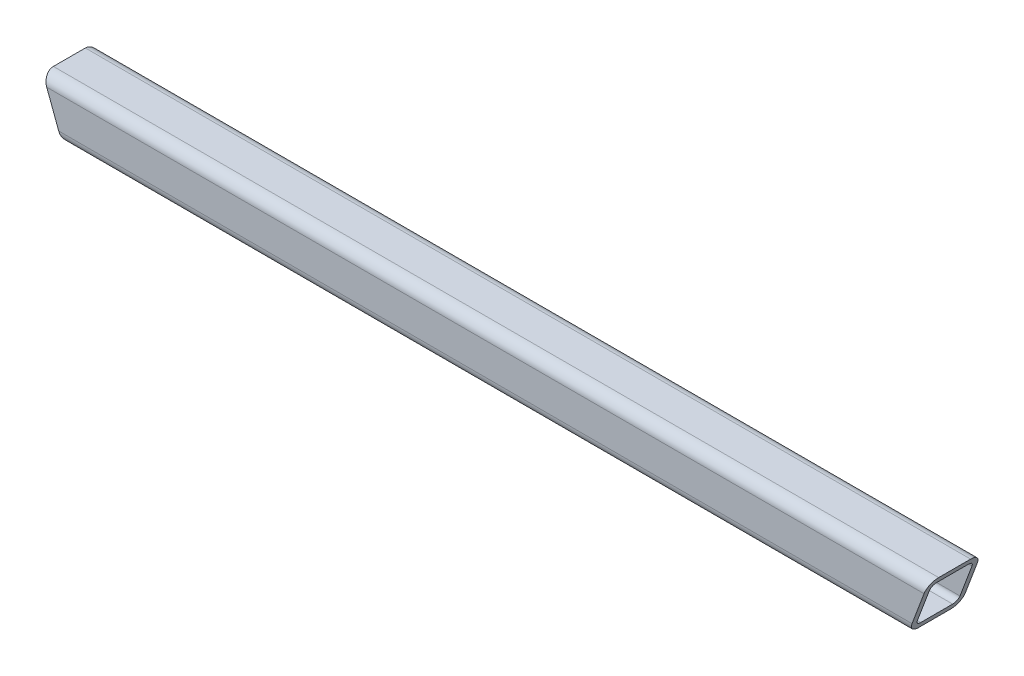
ISO-10303-21;
HEADER;
FILE_DESCRIPTION(('STEP AP214'),'2;1');
FILE_NAME('part.step','',(''),(''),'','','');
FILE_SCHEMA(('AUTOMOTIVE_DESIGN { 1 0 10303 214 1 1 1 1 }'));
ENDSEC;
DATA;
#1=APPLICATION_CONTEXT('core data for automotive mechanical design processes');
#2=APPLICATION_PROTOCOL_DEFINITION('international standard','automotive_design',2000,#1);
#3=PRODUCT_CONTEXT('',#1,'mechanical');
#4=PRODUCT('Part','Part','',(#3));
#5=PRODUCT_RELATED_PRODUCT_CATEGORY('part','',(#4));
#6=PRODUCT_DEFINITION_FORMATION('','',#4);
#7=PRODUCT_DEFINITION_CONTEXT('part definition',#1,'design');
#8=PRODUCT_DEFINITION('design','',#6,#7);
#9=PRODUCT_DEFINITION_SHAPE('','',#8);
#10=(LENGTH_UNIT() NAMED_UNIT(*) SI_UNIT(.MILLI.,.METRE.));
#11=(NAMED_UNIT(*) PLANE_ANGLE_UNIT() SI_UNIT($,.RADIAN.));
#12=(NAMED_UNIT(*) SI_UNIT($,.STERADIAN.) SOLID_ANGLE_UNIT());
#13=UNCERTAINTY_MEASURE_WITH_UNIT(LENGTH_MEASURE(1.E-05),#10,'distance_accuracy_value','');
#14=(GEOMETRIC_REPRESENTATION_CONTEXT(3) GLOBAL_UNCERTAINTY_ASSIGNED_CONTEXT((#13)) GLOBAL_UNIT_ASSIGNED_CONTEXT((#10,
#11,#12)) REPRESENTATION_CONTEXT('',''));
#15=CARTESIAN_POINT('',(0.,0.,0.));
#16=DIRECTION('',(0.,0.,1.));
#17=DIRECTION('',(1.,0.,0.));
#18=AXIS2_PLACEMENT_3D('',#15,#16,#17);
#19=CARTESIAN_POINT('',(150.,6.,1644.));
#20=DIRECTION('',(-1.,0.,0.));
#21=DIRECTION('',(0.,0.,1.));
#22=AXIS2_PLACEMENT_3D('',#19,#20,#21);
#23=CYLINDRICAL_SURFACE('',#22,4.);
#24=CARTESIAN_POINT('',(164.772001872659,6.,1644.));
#25=DIRECTION('',(0.936329177569044,-0.351123441588392,0.));
#26=DIRECTION('',(-0.351123441588392,-0.936329177569044,0.));
#27=AXIS2_PLACEMENT_3D('',#24,#25,#26);
#28=ELLIPSE('',#27,4.27200187265877,4.);
#29=CARTESIAN_POINT('',(164.772001872659,6.00000000000001,1640.));
#30=VERTEX_POINT('',#29);
#31=CARTESIAN_POINT('',(166.272001872659,10.,1644.));
#32=VERTEX_POINT('',#31);
#33=EDGE_CURVE('E167',#30,#32,#28,.T.);
#34=ORIENTED_EDGE('',*,*,#33,.F.);
#35=DIRECTION('',(-1.,0.,0.));
#36=VECTOR('',#35,1.);
#37=CARTESIAN_POINT('',(150.,6.,1640.));
#38=LINE('',#37,#36);
#39=CARTESIAN_POINT('',(-164.772001872659,6.,1640.));
#40=VERTEX_POINT('',#39);
#41=EDGE_CURVE('E43',#30,#40,#38,.T.);
#42=ORIENTED_EDGE('',*,*,#41,.T.);
#43=CARTESIAN_POINT('',(-164.772001872659,6.,1644.));
#44=DIRECTION('',(-0.936329177569045,-0.351123441588392,0.));
#45=DIRECTION('',(-0.351123441588392,0.936329177569045,0.));
#46=AXIS2_PLACEMENT_3D('',#43,#44,#45);
#47=ELLIPSE('',#46,4.27200187265877,4.);
#48=CARTESIAN_POINT('',(-166.272001872659,10.,1644.));
#49=VERTEX_POINT('',#48);
#50=EDGE_CURVE('E248',#49,#40,#47,.T.);
#51=ORIENTED_EDGE('',*,*,#50,.F.);
#52=DIRECTION('',(-1.,0.,0.));
#53=VECTOR('',#52,1.);
#54=CARTESIAN_POINT('',(150.,10.,1644.));
#55=LINE('',#54,#53);
#56=EDGE_CURVE('E241',#32,#49,#55,.T.);
#57=ORIENTED_EDGE('',*,*,#56,.F.);
#58=EDGE_LOOP('',(#34,#42,#51,#57));
#59=FACE_BOUND('',#58,.T.);
#60=ADVANCED_FACE('F39',(#59),#23,.T.);
#61=CARTESIAN_POINT('',(150.,10.,1644.));
#62=DIRECTION('',(0.,-1.,0.));
#63=DIRECTION('',(0.,0.,-1.));
#64=AXIS2_PLACEMENT_3D('',#61,#62,#63);
#65=PLANE('',#64);
#66=DIRECTION('',(0.,0.,1.));
#67=VECTOR('',#66,1.);
#68=CARTESIAN_POINT('',(166.272001872659,10.,1644.));
#69=LINE('',#68,#67);
#70=CARTESIAN_POINT('',(166.272001872659,10.,1656.));
#71=VERTEX_POINT('',#70);
#72=EDGE_CURVE('E185',#32,#71,#69,.T.);
#73=ORIENTED_EDGE('',*,*,#72,.F.);
#74=ORIENTED_EDGE('',*,*,#56,.T.);
#75=DIRECTION('',(0.,0.,-1.));
#76=VECTOR('',#75,1.);
#77=CARTESIAN_POINT('',(-166.272001872659,10.,1644.));
#78=LINE('',#77,#76);
#79=CARTESIAN_POINT('',(-166.272001872659,10.,1656.));
#80=VERTEX_POINT('',#79);
#81=EDGE_CURVE('E157',#80,#49,#78,.T.);
#82=ORIENTED_EDGE('',*,*,#81,.F.);
#83=DIRECTION('',(-1.,0.,0.));
#84=VECTOR('',#83,1.);
#85=CARTESIAN_POINT('',(150.,10.,1656.));
#86=LINE('',#85,#84);
#87=EDGE_CURVE('E240',#71,#80,#86,.T.);
#88=ORIENTED_EDGE('',*,*,#87,.F.);
#89=EDGE_LOOP('',(#73,#74,#82,#88));
#90=FACE_BOUND('',#89,.T.);
#91=ADVANCED_FACE('F295',(#90),#65,.F.);
#92=CARTESIAN_POINT('',(150.,6.,1656.));
#93=DIRECTION('',(-1.,0.,0.));
#94=DIRECTION('',(0.,0.,1.));
#95=AXIS2_PLACEMENT_3D('',#92,#93,#94);
#96=CYLINDRICAL_SURFACE('',#95,4.);
#97=CARTESIAN_POINT('',(164.772001872659,6.,1656.));
#98=DIRECTION('',(0.936329177569044,-0.351123441588392,0.));
#99=DIRECTION('',(-0.351123441588392,-0.936329177569044,0.));
#100=AXIS2_PLACEMENT_3D('',#97,#98,#99);
#101=ELLIPSE('',#100,4.27200187265877,4.);
#102=CARTESIAN_POINT('',(164.772001872659,6.,1660.));
#103=VERTEX_POINT('',#102);
#104=EDGE_CURVE('E182',#71,#103,#101,.T.);
#105=ORIENTED_EDGE('',*,*,#104,.F.);
#106=ORIENTED_EDGE('',*,*,#87,.T.);
#107=CARTESIAN_POINT('',(-164.772001872659,6.,1656.));
#108=DIRECTION('',(-0.936329177569045,-0.351123441588392,0.));
#109=DIRECTION('',(-0.351123441588392,0.936329177569045,0.));
#110=AXIS2_PLACEMENT_3D('',#107,#108,#109);
#111=ELLIPSE('',#110,4.27200187265877,4.);
#112=CARTESIAN_POINT('',(-164.772001872659,6.,1660.));
#113=VERTEX_POINT('',#112);
#114=EDGE_CURVE('E168',#113,#80,#111,.T.);
#115=ORIENTED_EDGE('',*,*,#114,.F.);
#116=DIRECTION('',(-1.,0.,0.));
#117=VECTOR('',#116,1.);
#118=CARTESIAN_POINT('',(150.,6.,1660.));
#119=LINE('',#118,#117);
#120=EDGE_CURVE('E238',#103,#113,#119,.T.);
#121=ORIENTED_EDGE('',*,*,#120,.F.);
#122=EDGE_LOOP('',(#105,#106,#115,#121));
#123=FACE_BOUND('',#122,.T.);
#124=ADVANCED_FACE('F293',(#123),#96,.T.);
#125=CARTESIAN_POINT('',(150.,-6.,1660.));
#126=DIRECTION('',(0.,0.,-1.));
#127=DIRECTION('',(-1.,0.,0.));
#128=AXIS2_PLACEMENT_3D('',#125,#126,#127);
#129=PLANE('',#128);
#130=DIRECTION('',(-0.351123441588392,-0.936329177569044,0.));
#131=VECTOR('',#130,1.);
#132=CARTESIAN_POINT('',(159.005590682879,-9.37709650607955,1660.));
#133=LINE('',#132,#131);
#134=CARTESIAN_POINT('',(160.272001872659,-6.,1660.));
#135=VERTEX_POINT('',#134);
#136=EDGE_CURVE('E177',#103,#135,#133,.T.);
#137=ORIENTED_EDGE('',*,*,#136,.F.);
#138=ORIENTED_EDGE('',*,*,#120,.T.);
#139=DIRECTION('',(-0.351123441588392,0.936329177569045,0.));
#140=VECTOR('',#139,1.);
#141=CARTESIAN_POINT('',(-122.019289313016,-108.007233492381,1660.));
#142=LINE('',#141,#140);
#143=CARTESIAN_POINT('',(-160.272001872659,-6.,1660.));
#144=VERTEX_POINT('',#143);
#145=EDGE_CURVE('E287',#144,#113,#142,.T.);
#146=ORIENTED_EDGE('',*,*,#145,.F.);
#147=DIRECTION('',(-1.,0.,0.));
#148=VECTOR('',#147,1.);
#149=CARTESIAN_POINT('',(150.,-6.,1660.));
#150=LINE('',#149,#148);
#151=EDGE_CURVE('E236',#135,#144,#150,.T.);
#152=ORIENTED_EDGE('',*,*,#151,.F.);
#153=EDGE_LOOP('',(#137,#138,#146,#152));
#154=FACE_BOUND('',#153,.T.);
#155=ADVANCED_FACE('F303',(#154),#129,.F.);
#156=CARTESIAN_POINT('',(150.,-6.,1656.));
#157=DIRECTION('',(-1.,0.,0.));
#158=DIRECTION('',(0.,0.,1.));
#159=AXIS2_PLACEMENT_3D('',#156,#157,#158);
#160=CYLINDRICAL_SURFACE('',#159,4.);
#161=CARTESIAN_POINT('',(160.272001872659,-6.,1656.));
#162=DIRECTION('',(0.936329177569044,-0.351123441588392,0.));
#163=DIRECTION('',(-0.351123441588392,-0.936329177569044,0.));
#164=AXIS2_PLACEMENT_3D('',#161,#162,#163);
#165=ELLIPSE('',#164,4.27200187265877,4.);
#166=CARTESIAN_POINT('',(158.772001872659,-10.,1656.));
#167=VERTEX_POINT('',#166);
#168=EDGE_CURVE('E173',#135,#167,#165,.T.);
#169=ORIENTED_EDGE('',*,*,#168,.F.);
#170=ORIENTED_EDGE('',*,*,#151,.T.);
#171=CARTESIAN_POINT('',(-160.272001872659,-6.,1656.));
#172=DIRECTION('',(-0.936329177569045,-0.351123441588392,0.));
#173=DIRECTION('',(-0.351123441588392,0.936329177569045,0.));
#174=AXIS2_PLACEMENT_3D('',#171,#172,#173);
#175=ELLIPSE('',#174,4.27200187265877,4.);
#176=CARTESIAN_POINT('',(-158.772001872659,-10.,1656.));
#177=VERTEX_POINT('',#176);
#178=EDGE_CURVE('E284',#177,#144,#175,.T.);
#179=ORIENTED_EDGE('',*,*,#178,.F.);
#180=DIRECTION('',(-1.,0.,0.));
#181=VECTOR('',#180,1.);
#182=CARTESIAN_POINT('',(150.,-10.,1656.));
#183=LINE('',#182,#181);
#184=EDGE_CURVE('E234',#167,#177,#183,.T.);
#185=ORIENTED_EDGE('',*,*,#184,.F.);
#186=EDGE_LOOP('',(#169,#170,#179,#185));
#187=FACE_BOUND('',#186,.T.);
#188=ADVANCED_FACE('F308',(#187),#160,.T.);
#189=CARTESIAN_POINT('',(150.,-10.,1656.));
#190=DIRECTION('',(0.,1.,0.));
#191=DIRECTION('',(0.,0.,1.));
#192=AXIS2_PLACEMENT_3D('',#189,#190,#191);
#193=PLANE('',#192);
#194=DIRECTION('',(0.,0.,-1.));
#195=VECTOR('',#194,1.);
#196=CARTESIAN_POINT('',(158.772001872659,-10.,1656.));
#197=LINE('',#196,#195);
#198=CARTESIAN_POINT('',(158.772001872659,-10.,1644.));
#199=VERTEX_POINT('',#198);
#200=EDGE_CURVE('E49',#167,#199,#197,.T.);
#201=ORIENTED_EDGE('',*,*,#200,.F.);
#202=ORIENTED_EDGE('',*,*,#184,.T.);
#203=DIRECTION('',(0.,0.,1.));
#204=VECTOR('',#203,1.);
#205=CARTESIAN_POINT('',(-158.772001872659,-10.,1656.));
#206=LINE('',#205,#204);
#207=CARTESIAN_POINT('',(-158.772001872659,-10.,1644.));
#208=VERTEX_POINT('',#207);
#209=EDGE_CURVE('E281',#208,#177,#206,.T.);
#210=ORIENTED_EDGE('',*,*,#209,.F.);
#211=DIRECTION('',(-1.,0.,0.));
#212=VECTOR('',#211,1.);
#213=CARTESIAN_POINT('',(150.,-10.,1644.));
#214=LINE('',#213,#212);
#215=EDGE_CURVE('E192',#199,#208,#214,.T.);
#216=ORIENTED_EDGE('',*,*,#215,.F.);
#217=EDGE_LOOP('',(#201,#202,#210,#216));
#218=FACE_BOUND('',#217,.T.);
#219=ADVANCED_FACE('F312',(#218),#193,.F.);
#220=CARTESIAN_POINT('',(150.,-6.,1644.));
#221=DIRECTION('',(-1.,0.,0.));
#222=DIRECTION('',(0.,0.,1.));
#223=AXIS2_PLACEMENT_3D('',#220,#221,#222);
#224=CYLINDRICAL_SURFACE('',#223,4.);
#225=CARTESIAN_POINT('',(160.272001872659,-6.,1644.));
#226=DIRECTION('',(0.936329177569044,-0.351123441588392,0.));
#227=DIRECTION('',(-0.351123441588392,-0.936329177569044,0.));
#228=AXIS2_PLACEMENT_3D('',#225,#226,#227);
#229=ELLIPSE('',#228,4.27200187265877,4.);
#230=CARTESIAN_POINT('',(160.272001872659,-6.,1640.));
#231=VERTEX_POINT('',#230);
#232=EDGE_CURVE('E11',#199,#231,#229,.T.);
#233=ORIENTED_EDGE('',*,*,#232,.F.);
#234=ORIENTED_EDGE('',*,*,#215,.T.);
#235=CARTESIAN_POINT('',(-160.272001872659,-6.,1644.));
#236=DIRECTION('',(-0.936329177569045,-0.351123441588392,0.));
#237=DIRECTION('',(-0.351123441588392,0.936329177569045,0.));
#238=AXIS2_PLACEMENT_3D('',#235,#236,#237);
#239=ELLIPSE('',#238,4.27200187265877,4.);
#240=CARTESIAN_POINT('',(-160.272001872659,-6.00000000000002,1640.));
#241=VERTEX_POINT('',#240);
#242=EDGE_CURVE('E153',#241,#208,#239,.T.);
#243=ORIENTED_EDGE('',*,*,#242,.F.);
#244=DIRECTION('',(-1.,0.,0.));
#245=VECTOR('',#244,1.);
#246=CARTESIAN_POINT('',(150.,-6.,1640.));
#247=LINE('',#246,#245);
#248=EDGE_CURVE('E148',#231,#241,#247,.T.);
#249=ORIENTED_EDGE('',*,*,#248,.F.);
#250=EDGE_LOOP('',(#233,#234,#243,#249));
#251=FACE_BOUND('',#250,.T.);
#252=ADVANCED_FACE('F150',(#251),#224,.T.);
#253=CARTESIAN_POINT('',(150.,6.,1656.));
#254=DIRECTION('',(-1.,0.,0.));
#255=DIRECTION('',(0.,0.,1.));
#256=AXIS2_PLACEMENT_3D('',#253,#254,#255);
#257=CYLINDRICAL_SURFACE('',#256,2.);
#258=DIRECTION('',(-1.,0.,0.));
#259=VECTOR('',#258,1.);
#260=CARTESIAN_POINT('',(150.,8.,1656.));
#261=LINE('',#260,#259);
#262=CARTESIAN_POINT('',(165.522001872659,8.,1656.));
#263=VERTEX_POINT('',#262);
#264=CARTESIAN_POINT('',(-165.522001872659,8.,1656.));
#265=VERTEX_POINT('',#264);
#266=EDGE_CURVE('E196',#263,#265,#261,.T.);
#267=ORIENTED_EDGE('',*,*,#266,.F.);
#268=CARTESIAN_POINT('',(164.772001872659,6.,1656.));
#269=DIRECTION('',(0.936329177569044,-0.351123441588392,0.));
#270=DIRECTION('',(-0.351123441588392,-0.936329177569044,0.));
#271=AXIS2_PLACEMENT_3D('',#268,#269,#270);
#272=ELLIPSE('',#271,2.13600093632938,2.);
#273=CARTESIAN_POINT('',(164.772001872659,6.,1658.));
#274=VERTEX_POINT('',#273);
#275=EDGE_CURVE('E189',#263,#274,#272,.T.);
#276=ORIENTED_EDGE('',*,*,#275,.T.);
#277=DIRECTION('',(-1.,0.,0.));
#278=VECTOR('',#277,1.);
#279=CARTESIAN_POINT('',(150.,6.,1658.));
#280=LINE('',#279,#278);
#281=CARTESIAN_POINT('',(-164.772001872659,5.99999999999999,1658.));
#282=VERTEX_POINT('',#281);
#283=EDGE_CURVE('E191',#274,#282,#280,.T.);
#284=ORIENTED_EDGE('',*,*,#283,.T.);
#285=CARTESIAN_POINT('',(-164.772001872659,6.,1656.));
#286=DIRECTION('',(-0.936329177569045,-0.351123441588392,0.));
#287=DIRECTION('',(-0.351123441588392,0.936329177569045,0.));
#288=AXIS2_PLACEMENT_3D('',#285,#286,#287);
#289=ELLIPSE('',#288,2.13600093632938,2.);
#290=EDGE_CURVE('E197',#282,#265,#289,.T.);
#291=ORIENTED_EDGE('',*,*,#290,.T.);
#292=EDGE_LOOP('',(#267,#276,#284,#291));
#293=FACE_BOUND('',#292,.T.);
#294=ADVANCED_FACE('F318',(#293),#257,.F.);
#295=CARTESIAN_POINT('',(150.,8.,1644.));
#296=DIRECTION('',(0.,-1.,0.));
#297=DIRECTION('',(0.,0.,-1.));
#298=AXIS2_PLACEMENT_3D('',#295,#296,#297);
#299=PLANE('',#298);
#300=DIRECTION('',(-1.,0.,0.));
#301=VECTOR('',#300,1.);
#302=CARTESIAN_POINT('',(150.,8.,1644.));
#303=LINE('',#302,#301);
#304=CARTESIAN_POINT('',(165.522001872659,8.,1644.));
#305=VERTEX_POINT('',#304);
#306=CARTESIAN_POINT('',(-165.522001872659,8.,1644.));
#307=VERTEX_POINT('',#306);
#308=EDGE_CURVE('E201',#305,#307,#303,.T.);
#309=ORIENTED_EDGE('',*,*,#308,.F.);
#310=DIRECTION('',(0.,0.,1.));
#311=VECTOR('',#310,1.);
#312=CARTESIAN_POINT('',(165.522001872659,8.,1644.));
#313=LINE('',#312,#311);
#314=EDGE_CURVE('E193',#305,#263,#313,.T.);
#315=ORIENTED_EDGE('',*,*,#314,.T.);
#316=ORIENTED_EDGE('',*,*,#266,.T.);
#317=DIRECTION('',(0.,0.,-1.));
#318=VECTOR('',#317,1.);
#319=CARTESIAN_POINT('',(-165.522001872659,8.,1644.));
#320=LINE('',#319,#318);
#321=EDGE_CURVE('E202',#265,#307,#320,.T.);
#322=ORIENTED_EDGE('',*,*,#321,.T.);
#323=EDGE_LOOP('',(#309,#315,#316,#322));
#324=FACE_BOUND('',#323,.T.);
#325=ADVANCED_FACE('F324',(#324),#299,.T.);
#326=CARTESIAN_POINT('',(150.,6.,1644.));
#327=DIRECTION('',(-1.,0.,0.));
#328=DIRECTION('',(0.,0.,1.));
#329=AXIS2_PLACEMENT_3D('',#326,#327,#328);
#330=CYLINDRICAL_SURFACE('',#329,2.);
#331=DIRECTION('',(-1.,0.,0.));
#332=VECTOR('',#331,1.);
#333=CARTESIAN_POINT('',(150.,6.,1642.));
#334=LINE('',#333,#332);
#335=CARTESIAN_POINT('',(164.772001872659,6.,1642.));
#336=VERTEX_POINT('',#335);
#337=CARTESIAN_POINT('',(-164.772001872659,5.99999999999999,1642.));
#338=VERTEX_POINT('',#337);
#339=EDGE_CURVE('E206',#336,#338,#334,.T.);
#340=ORIENTED_EDGE('',*,*,#339,.F.);
#341=CARTESIAN_POINT('',(164.772001872659,6.,1644.));
#342=DIRECTION('',(0.936329177569044,-0.351123441588392,0.));
#343=DIRECTION('',(-0.351123441588392,-0.936329177569044,0.));
#344=AXIS2_PLACEMENT_3D('',#341,#342,#343);
#345=ELLIPSE('',#344,2.13600093632938,2.);
#346=EDGE_CURVE('E198',#336,#305,#345,.T.);
#347=ORIENTED_EDGE('',*,*,#346,.T.);
#348=ORIENTED_EDGE('',*,*,#308,.T.);
#349=CARTESIAN_POINT('',(-164.772001872659,6.,1644.));
#350=DIRECTION('',(-0.936329177569045,-0.351123441588392,0.));
#351=DIRECTION('',(-0.351123441588392,0.936329177569045,0.));
#352=AXIS2_PLACEMENT_3D('',#349,#350,#351);
#353=ELLIPSE('',#352,2.13600093632938,2.);
#354=EDGE_CURVE('E207',#307,#338,#353,.T.);
#355=ORIENTED_EDGE('',*,*,#354,.T.);
#356=EDGE_LOOP('',(#340,#347,#348,#355));
#357=FACE_BOUND('',#356,.T.);
#358=ADVANCED_FACE('F328',(#357),#330,.F.);
#359=CARTESIAN_POINT('',(150.,6.,1642.));
#360=DIRECTION('',(0.,0.,1.));
#361=DIRECTION('',(1.,0.,0.));
#362=AXIS2_PLACEMENT_3D('',#359,#360,#361);
#363=PLANE('',#362);
#364=DIRECTION('',(-1.,0.,0.));
#365=VECTOR('',#364,1.);
#366=CARTESIAN_POINT('',(150.,-6.,1642.));
#367=LINE('',#366,#365);
#368=CARTESIAN_POINT('',(160.272001872659,-6.,1642.));
#369=VERTEX_POINT('',#368);
#370=CARTESIAN_POINT('',(-160.272001872659,-6.,1642.));
#371=VERTEX_POINT('',#370);
#372=EDGE_CURVE('E211',#369,#371,#367,.T.);
#373=ORIENTED_EDGE('',*,*,#372,.F.);
#374=DIRECTION('',(0.351123441588392,0.936329177569044,0.));
#375=VECTOR('',#374,1.);
#376=CARTESIAN_POINT('',(162.950796162331,1.14345143912593,1642.));
#377=LINE('',#376,#375);
#378=EDGE_CURVE('E203',#369,#336,#377,.T.);
#379=ORIENTED_EDGE('',*,*,#378,.T.);
#380=ORIENTED_EDGE('',*,*,#339,.T.);
#381=DIRECTION('',(0.351123441588392,-0.936329177569045,0.));
#382=VECTOR('',#381,1.);
#383=CARTESIAN_POINT('',(-125.964494792468,-97.4866855471756,1642.));
#384=LINE('',#383,#382);
#385=EDGE_CURVE('E212',#338,#371,#384,.T.);
#386=ORIENTED_EDGE('',*,*,#385,.T.);
#387=EDGE_LOOP('',(#373,#379,#380,#386));
#388=FACE_BOUND('',#387,.T.);
#389=ADVANCED_FACE('F332',(#388),#363,.T.);
#390=CARTESIAN_POINT('',(150.,-6.,1644.));
#391=DIRECTION('',(-1.,0.,0.));
#392=DIRECTION('',(0.,0.,1.));
#393=AXIS2_PLACEMENT_3D('',#390,#391,#392);
#394=CYLINDRICAL_SURFACE('',#393,2.);
#395=DIRECTION('',(-1.,0.,0.));
#396=VECTOR('',#395,1.);
#397=CARTESIAN_POINT('',(150.,-8.,1644.));
#398=LINE('',#397,#396);
#399=CARTESIAN_POINT('',(159.522001872659,-8.,1644.));
#400=VERTEX_POINT('',#399);
#401=CARTESIAN_POINT('',(-159.522001872659,-8.,1644.));
#402=VERTEX_POINT('',#401);
#403=EDGE_CURVE('E216',#400,#402,#398,.T.);
#404=ORIENTED_EDGE('',*,*,#403,.F.);
#405=CARTESIAN_POINT('',(160.272001872659,-6.,1644.));
#406=DIRECTION('',(0.936329177569044,-0.351123441588392,0.));
#407=DIRECTION('',(-0.351123441588392,-0.936329177569044,0.));
#408=AXIS2_PLACEMENT_3D('',#405,#406,#407);
#409=ELLIPSE('',#408,2.13600093632938,2.);
#410=EDGE_CURVE('E208',#400,#369,#409,.T.);
#411=ORIENTED_EDGE('',*,*,#410,.T.);
#412=ORIENTED_EDGE('',*,*,#372,.T.);
#413=CARTESIAN_POINT('',(-160.272001872659,-6.,1644.));
#414=DIRECTION('',(-0.936329177569045,-0.351123441588392,0.));
#415=DIRECTION('',(-0.351123441588392,0.936329177569045,0.));
#416=AXIS2_PLACEMENT_3D('',#413,#414,#415);
#417=ELLIPSE('',#416,2.13600093632938,2.);
#418=EDGE_CURVE('E217',#371,#402,#417,.T.);
#419=ORIENTED_EDGE('',*,*,#418,.T.);
#420=EDGE_LOOP('',(#404,#411,#412,#419));
#421=FACE_BOUND('',#420,.T.);
#422=ADVANCED_FACE('F336',(#421),#394,.F.);
#423=CARTESIAN_POINT('',(150.,-8.,1656.));
#424=DIRECTION('',(0.,1.,0.));
#425=DIRECTION('',(0.,0.,1.));
#426=AXIS2_PLACEMENT_3D('',#423,#424,#425);
#427=PLANE('',#426);
#428=DIRECTION('',(-1.,0.,0.));
#429=VECTOR('',#428,1.);
#430=CARTESIAN_POINT('',(150.,-8.,1656.));
#431=LINE('',#430,#429);
#432=CARTESIAN_POINT('',(159.522001872659,-8.,1656.));
#433=VERTEX_POINT('',#432);
#434=CARTESIAN_POINT('',(-159.522001872659,-8.,1656.));
#435=VERTEX_POINT('',#434);
#436=EDGE_CURVE('E220',#433,#435,#431,.T.);
#437=ORIENTED_EDGE('',*,*,#436,.F.);
#438=DIRECTION('',(0.,0.,-1.));
#439=VECTOR('',#438,1.);
#440=CARTESIAN_POINT('',(159.522001872659,-8.,1656.));
#441=LINE('',#440,#439);
#442=EDGE_CURVE('E213',#433,#400,#441,.T.);
#443=ORIENTED_EDGE('',*,*,#442,.T.);
#444=ORIENTED_EDGE('',*,*,#403,.T.);
#445=DIRECTION('',(0.,0.,1.));
#446=VECTOR('',#445,1.);
#447=CARTESIAN_POINT('',(-159.522001872659,-8.,1656.));
#448=LINE('',#447,#446);
#449=EDGE_CURVE('E221',#402,#435,#448,.T.);
#450=ORIENTED_EDGE('',*,*,#449,.T.);
#451=EDGE_LOOP('',(#437,#443,#444,#450));
#452=FACE_BOUND('',#451,.T.);
#453=ADVANCED_FACE('F340',(#452),#427,.T.);
#454=CARTESIAN_POINT('',(150.,-6.,1656.));
#455=DIRECTION('',(-1.,0.,0.));
#456=DIRECTION('',(0.,0.,1.));
#457=AXIS2_PLACEMENT_3D('',#454,#455,#456);
#458=CYLINDRICAL_SURFACE('',#457,2.);
#459=DIRECTION('',(-1.,0.,0.));
#460=VECTOR('',#459,1.);
#461=CARTESIAN_POINT('',(150.,-6.,1658.));
#462=LINE('',#461,#460);
#463=CARTESIAN_POINT('',(160.272001872659,-6.,1658.));
#464=VERTEX_POINT('',#463);
#465=CARTESIAN_POINT('',(-160.272001872659,-5.99999999999999,1658.));
#466=VERTEX_POINT('',#465);
#467=EDGE_CURVE('E223',#464,#466,#462,.T.);
#468=ORIENTED_EDGE('',*,*,#467,.F.);
#469=CARTESIAN_POINT('',(160.272001872659,-6.,1656.));
#470=DIRECTION('',(0.936329177569044,-0.351123441588392,0.));
#471=DIRECTION('',(-0.351123441588392,-0.936329177569044,0.));
#472=AXIS2_PLACEMENT_3D('',#469,#470,#471);
#473=ELLIPSE('',#472,2.13600093632938,2.);
#474=EDGE_CURVE('E218',#464,#433,#473,.T.);
#475=ORIENTED_EDGE('',*,*,#474,.T.);
#476=ORIENTED_EDGE('',*,*,#436,.T.);
#477=CARTESIAN_POINT('',(-160.272001872659,-6.,1656.));
#478=DIRECTION('',(-0.936329177569045,-0.351123441588392,0.));
#479=DIRECTION('',(-0.351123441588392,0.936329177569045,0.));
#480=AXIS2_PLACEMENT_3D('',#477,#478,#479);
#481=ELLIPSE('',#480,2.13600093632938,2.);
#482=EDGE_CURVE('E226',#435,#466,#481,.T.);
#483=ORIENTED_EDGE('',*,*,#482,.T.);
#484=EDGE_LOOP('',(#468,#475,#476,#483));
#485=FACE_BOUND('',#484,.T.);
#486=ADVANCED_FACE('F344',(#485),#458,.F.);
#487=CARTESIAN_POINT('',(150.,-6.,1658.));
#488=DIRECTION('',(0.,0.,-1.));
#489=DIRECTION('',(-1.,0.,0.));
#490=AXIS2_PLACEMENT_3D('',#487,#488,#489);
#491=PLANE('',#490);
#492=ORIENTED_EDGE('',*,*,#283,.F.);
#493=DIRECTION('',(-0.351123441588392,-0.936329177569044,0.));
#494=VECTOR('',#493,1.);
#495=CARTESIAN_POINT('',(159.005590682879,-9.37709650607954,1658.));
#496=LINE('',#495,#494);
#497=EDGE_CURVE('E57',#274,#464,#496,.T.);
#498=ORIENTED_EDGE('',*,*,#497,.T.);
#499=ORIENTED_EDGE('',*,*,#467,.T.);
#500=DIRECTION('',(-0.351123441588392,0.936329177569045,0.));
#501=VECTOR('',#500,1.);
#502=CARTESIAN_POINT('',(-122.019289313016,-108.007233492381,1658.));
#503=LINE('',#502,#501);
#504=EDGE_CURVE('E158',#466,#282,#503,.T.);
#505=ORIENTED_EDGE('',*,*,#504,.T.);
#506=EDGE_LOOP('',(#492,#498,#499,#505));
#507=FACE_BOUND('',#506,.T.);
#508=ADVANCED_FACE('F321',(#507),#491,.T.);
#509=CARTESIAN_POINT('',(150.,6.,1640.));
#510=DIRECTION('',(0.,0.,1.));
#511=DIRECTION('',(1.,0.,0.));
#512=AXIS2_PLACEMENT_3D('',#509,#510,#511);
#513=PLANE('',#512);
#514=DIRECTION('',(0.351123441588392,0.936329177569044,0.));
#515=VECTOR('',#514,1.);
#516=CARTESIAN_POINT('',(162.950796162331,1.14345143912593,1640.));
#517=LINE('',#516,#515);
#518=EDGE_CURVE('E162',#231,#30,#517,.T.);
#519=ORIENTED_EDGE('',*,*,#518,.F.);
#520=ORIENTED_EDGE('',*,*,#248,.T.);
#521=DIRECTION('',(0.351123441588392,-0.936329177569045,0.));
#522=VECTOR('',#521,1.);
#523=CARTESIAN_POINT('',(-125.964494792468,-97.4866855471755,1640.));
#524=LINE('',#523,#522);
#525=EDGE_CURVE('E250',#40,#241,#524,.T.);
#526=ORIENTED_EDGE('',*,*,#525,.F.);
#527=ORIENTED_EDGE('',*,*,#41,.F.);
#528=EDGE_LOOP('',(#519,#520,#526,#527));
#529=FACE_BOUND('',#528,.T.);
#530=ADVANCED_FACE('F163',(#529),#513,.F.);
#531=CARTESIAN_POINT('',(-160.978193422605,-4.11682253347691,1638.27528428506));
#532=DIRECTION('',(-0.936329177569045,-0.351123441588392,0.));
#533=DIRECTION('',(0.351123441588392,-0.936329177569045,0.));
#534=AXIS2_PLACEMENT_3D('',#531,#532,#533);
#535=PLANE('',#534);
#536=ORIENTED_EDGE('',*,*,#290,.F.);
#537=ORIENTED_EDGE('',*,*,#504,.F.);
#538=ORIENTED_EDGE('',*,*,#482,.F.);
#539=ORIENTED_EDGE('',*,*,#449,.F.);
#540=ORIENTED_EDGE('',*,*,#418,.F.);
#541=ORIENTED_EDGE('',*,*,#385,.F.);
#542=ORIENTED_EDGE('',*,*,#354,.F.);
#543=ORIENTED_EDGE('',*,*,#321,.F.);
#544=EDGE_LOOP('',(#536,#537,#538,#539,#540,#541,#542,#543));
#545=FACE_BOUND('',#544,.T.);
#546=ORIENTED_EDGE('',*,*,#81,.T.);
#547=ORIENTED_EDGE('',*,*,#50,.T.);
#548=ORIENTED_EDGE('',*,*,#525,.T.);
#549=ORIENTED_EDGE('',*,*,#242,.T.);
#550=ORIENTED_EDGE('',*,*,#209,.T.);
#551=ORIENTED_EDGE('',*,*,#178,.T.);
#552=ORIENTED_EDGE('',*,*,#145,.T.);
#553=ORIENTED_EDGE('',*,*,#114,.T.);
#554=EDGE_LOOP('',(#546,#547,#548,#549,#550,#551,#552,#553));
#555=FACE_BOUND('',#554,.T.);
#556=ADVANCED_FACE('F253',(#545,#555),#535,.T.);
#557=CARTESIAN_POINT('',(160.978193422605,-4.11682253347689,1661.72471571494));
#558=DIRECTION('',(0.936329177569044,-0.351123441588392,0.));
#559=DIRECTION('',(0.351123441588392,0.936329177569044,0.));
#560=AXIS2_PLACEMENT_3D('',#557,#558,#559);
#561=PLANE('',#560);
#562=ORIENTED_EDGE('',*,*,#275,.F.);
#563=ORIENTED_EDGE('',*,*,#314,.F.);
#564=ORIENTED_EDGE('',*,*,#346,.F.);
#565=ORIENTED_EDGE('',*,*,#378,.F.);
#566=ORIENTED_EDGE('',*,*,#410,.F.);
#567=ORIENTED_EDGE('',*,*,#442,.F.);
#568=ORIENTED_EDGE('',*,*,#474,.F.);
#569=ORIENTED_EDGE('',*,*,#497,.F.);
#570=EDGE_LOOP('',(#562,#563,#564,#565,#566,#567,#568,#569));
#571=FACE_BOUND('',#570,.T.);
#572=ORIENTED_EDGE('',*,*,#518,.T.);
#573=ORIENTED_EDGE('',*,*,#33,.T.);
#574=ORIENTED_EDGE('',*,*,#72,.T.);
#575=ORIENTED_EDGE('',*,*,#104,.T.);
#576=ORIENTED_EDGE('',*,*,#136,.T.);
#577=ORIENTED_EDGE('',*,*,#168,.T.);
#578=ORIENTED_EDGE('',*,*,#200,.T.);
#579=ORIENTED_EDGE('',*,*,#232,.T.);
#580=EDGE_LOOP('',(#572,#573,#574,#575,#576,#577,#578,#579));
#581=FACE_BOUND('',#580,.T.);
#582=ADVANCED_FACE('F41',(#571,#581),#561,.T.);
#583=CLOSED_SHELL('',(#60,#91,#124,#155,#188,#219,#252,#294,#325,#358,#389,#422,#453,#486,#508,
#530,#556,#582));
#584=MANIFOLD_SOLID_BREP('B2',#583);
#585=ADVANCED_BREP_SHAPE_REPRESENTATION('',(#18,#584),#14);
#586=SHAPE_DEFINITION_REPRESENTATION(#9,#585);
ENDSEC;
END-ISO-10303-21;
